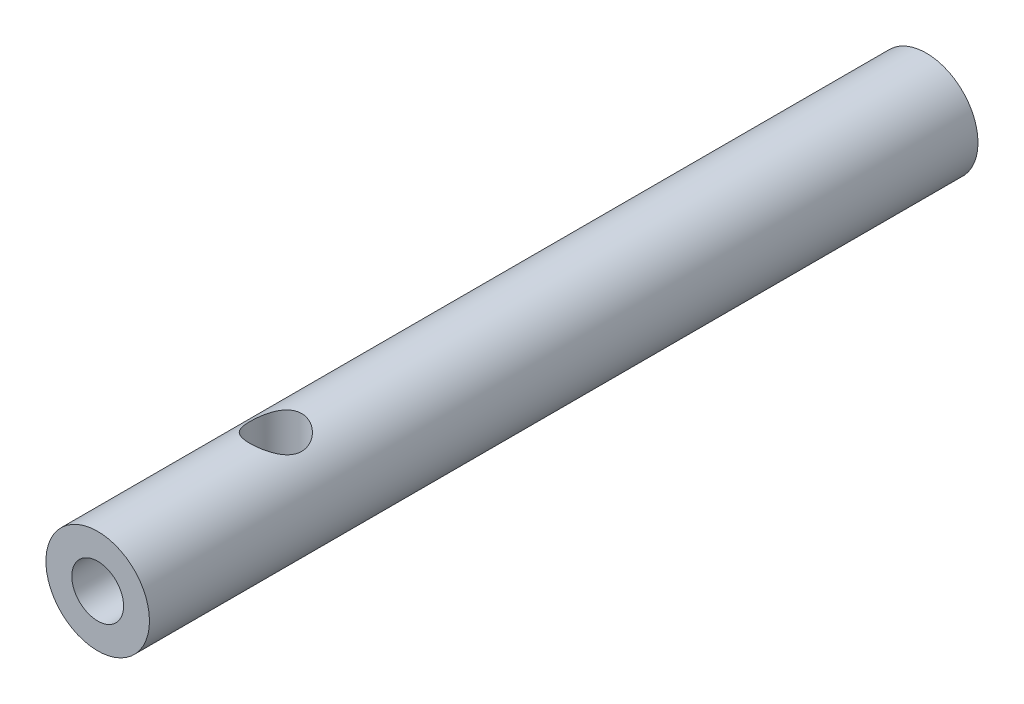
ISO-10303-21;
HEADER;
FILE_DESCRIPTION(('STEP AP214'),'2;1');
FILE_NAME('part.step','',(''),(''),'','','');
FILE_SCHEMA(('AUTOMOTIVE_DESIGN { 1 0 10303 214 1 1 1 1 }'));
ENDSEC;
DATA;
#1=APPLICATION_CONTEXT('core data for automotive mechanical design processes');
#2=APPLICATION_PROTOCOL_DEFINITION('international standard','automotive_design',2000,#1);
#3=PRODUCT_CONTEXT('',#1,'mechanical');
#4=PRODUCT('Part','Part','',(#3));
#5=PRODUCT_RELATED_PRODUCT_CATEGORY('part','',(#4));
#6=PRODUCT_DEFINITION_FORMATION('','',#4);
#7=PRODUCT_DEFINITION_CONTEXT('part definition',#1,'design');
#8=PRODUCT_DEFINITION('design','',#6,#7);
#9=PRODUCT_DEFINITION_SHAPE('','',#8);
#10=(LENGTH_UNIT() NAMED_UNIT(*) SI_UNIT(.MILLI.,.METRE.));
#11=(NAMED_UNIT(*) PLANE_ANGLE_UNIT() SI_UNIT($,.RADIAN.));
#12=(NAMED_UNIT(*) SI_UNIT($,.STERADIAN.) SOLID_ANGLE_UNIT());
#13=UNCERTAINTY_MEASURE_WITH_UNIT(LENGTH_MEASURE(1.E-05),#10,'distance_accuracy_value','');
#14=(GEOMETRIC_REPRESENTATION_CONTEXT(3) GLOBAL_UNCERTAINTY_ASSIGNED_CONTEXT((#13)) GLOBAL_UNIT_ASSIGNED_CONTEXT((#10,
#11,#12)) REPRESENTATION_CONTEXT('',''));
#15=CARTESIAN_POINT('',(0.,0.,0.));
#16=DIRECTION('',(0.,0.,1.));
#17=DIRECTION('',(1.,0.,0.));
#18=AXIS2_PLACEMENT_3D('',#15,#16,#17);
#19=CARTESIAN_POINT('',(0.,0.,-101.6));
#20=DIRECTION('',(0.,0.,1.));
#21=DIRECTION('',(1.,0.,0.));
#22=AXIS2_PLACEMENT_3D('',#19,#20,#21);
#23=CYLINDRICAL_SURFACE('',#22,6.35);
#24=CARTESIAN_POINT('',(0.,-6.35,-25.019));
#25=CARTESIAN_POINT('',(-0.0834969220594999,-6.34999931166444,-25.0189991122824));
#26=CARTESIAN_POINT('',(-0.167002655580042,-6.34834758911701,-25.015700125554));
#27=CARTESIAN_POINT('',(-0.333378330258781,-6.34179105821714,-25.0025541254501));
#28=CARTESIAN_POINT('',(-0.416247978955772,-6.33688483467113,-24.9927042634742));
#29=CARTESIAN_POINT('',(-0.66318203064701,-6.31742426748325,-24.953427934954));
#30=CARTESIAN_POINT('',(-0.825450146761554,-6.29812827299425,-24.9142749225986));
#31=CARTESIAN_POINT('',(-1.13965128900426,-6.2489182313574,-24.8120092887059));
#32=CARTESIAN_POINT('',(-1.29162180811868,-6.21904547786825,-24.7489897807566));
#33=CARTESIAN_POINT('',(-1.58264035037879,-6.15142812041637,-24.6012639263711));
#34=CARTESIAN_POINT('',(-1.72168939123018,-6.11368413715877,-24.516559289849));
#35=CARTESIAN_POINT('',(-1.99234108848171,-6.03111096182982,-24.3220303702658));
#36=CARTESIAN_POINT('',(-2.12298433900092,-5.98599127270818,-24.2109964222061));
#37=CARTESIAN_POINT('',(-2.36467069069853,-5.89470535591056,-23.9696033164272));
#38=CARTESIAN_POINT('',(-2.47569885601321,-5.84853836069043,-23.8392295702336));
#39=CARTESIAN_POINT('',(-2.68368848497886,-5.75623634934464,-23.5505790522467));
#40=CARTESIAN_POINT('',(-2.77889135161934,-5.71038146176788,-23.3909224686984));
#41=CARTESIAN_POINT('',(-2.90019349951534,-5.64919759286363,-23.1394520128256));
#42=CARTESIAN_POINT('',(-2.93705266116892,-5.63006420805933,-23.0535999381713));
#43=CARTESIAN_POINT('',(-3.00322508739606,-5.59504604853267,-22.8784143862936));
#44=CARTESIAN_POINT('',(-3.03254280972159,-5.57915935583429,-22.7890830018194));
#45=CARTESIAN_POINT('',(-3.08174263292982,-5.55212611635049,-22.6129894480353));
#46=CARTESIAN_POINT('',(-3.10208128111978,-5.54075429137746,-22.5263892059714));
#47=CARTESIAN_POINT('',(-3.13545600360765,-5.52193654886444,-22.3514127210056));
#48=CARTESIAN_POINT('',(-3.14849595237257,-5.51448854851135,-22.2630374462283));
#49=CARTESIAN_POINT('',(-3.1670771305344,-5.50383875782918,-22.0852932611514));
#50=CARTESIAN_POINT('',(-3.1726228759965,-5.50063441026522,-21.9959249820126));
#51=CARTESIAN_POINT('',(-3.17614778806993,-5.49859788398609,-21.8170192158219));
#52=CARTESIAN_POINT('',(-3.17412767659872,-5.49976528812799,-21.7274817457287));
#53=CARTESIAN_POINT('',(-3.1581193033026,-5.50899190362733,-21.4812521242756));
#54=CARTESIAN_POINT('',(-3.13621253452965,-5.52160857357707,-21.3251582701866));
#55=CARTESIAN_POINT('',(-3.07003746372168,-5.55866493052824,-21.0193533586935));
#56=CARTESIAN_POINT('',(-3.02576203854504,-5.58310838358077,-20.8696443509772));
#57=CARTESIAN_POINT('',(-2.91531509833647,-5.64157885407237,-20.5764557034359));
#58=CARTESIAN_POINT('',(-2.84865758129417,-5.67581583876129,-20.4332023900634));
#59=CARTESIAN_POINT('',(-2.69570761526054,-5.75003268807633,-20.159233913826));
#60=CARTESIAN_POINT('',(-2.60940634674629,-5.79001512927804,-20.0285244203915));
#61=CARTESIAN_POINT('',(-2.40685964249565,-5.87734289018611,-19.7658957257497));
#62=CARTESIAN_POINT('',(-2.28820488335253,-5.92497898403936,-19.6359246151435));
#63=CARTESIAN_POINT('',(-2.03058898448427,-6.01813700574905,-19.3969148571362));
#64=CARTESIAN_POINT('',(-1.89161819563546,-6.06365791538158,-19.2878862136413));
#65=CARTESIAN_POINT('',(-1.58913989972483,-6.1500381059768,-19.0890980802803));
#66=CARTESIAN_POINT('',(-1.42479265164788,-6.19058274974572,-19.0004685144201));
#67=CARTESIAN_POINT('',(-1.08098023585583,-6.25976272299952,-18.8528419183646));
#68=CARTESIAN_POINT('',(-0.901527205073896,-6.28840750578946,-18.7938213588683));
#69=CARTESIAN_POINT('',(-0.548533610626833,-6.32854759690358,-18.711940596601));
#70=CARTESIAN_POINT('',(-0.375734359385244,-6.34126679122995,-18.6864903274127));
#71=CARTESIAN_POINT('',(-0.0278752299448301,-6.35231817716325,-18.6643494777397));
#72=CARTESIAN_POINT('',(0.147183538060021,-6.35065718436129,-18.6676452728607));
#73=CARTESIAN_POINT('',(0.480164686080365,-6.33384535408399,-18.7014062359454));
#74=CARTESIAN_POINT('',(0.638363620564192,-6.31975005060431,-18.7297457914748));
#75=CARTESIAN_POINT('',(0.947441883053003,-6.28085393924121,-18.8094558782099));
#76=CARTESIAN_POINT('',(1.09832040207141,-6.25605195113515,-18.8608289484773));
#77=CARTESIAN_POINT('',(1.39347133182512,-6.19709998236334,-18.9864951309378));
#78=CARTESIAN_POINT('',(1.53743151047822,-6.16270299610717,-19.0614015841112));
#79=CARTESIAN_POINT('',(1.8112148234104,-6.08787118465664,-19.2313164256859));
#80=CARTESIAN_POINT('',(1.94103189959928,-6.0474337895468,-19.3263333773854));
#81=CARTESIAN_POINT('',(2.19636241342679,-5.95973602709938,-19.5445393503738));
#82=CARTESIAN_POINT('',(2.3202013468198,-5.91219559251098,-19.6695786071116));
#83=CARTESIAN_POINT('',(2.54589381918874,-5.81858093231368,-19.9387623551498));
#84=CARTESIAN_POINT('',(2.64773214935251,-5.77250773963547,-20.0829199523809));
#85=CARTESIAN_POINT('',(2.83117262876716,-5.68487535288742,-20.3950686019584));
#86=CARTESIAN_POINT('',(2.91155594998014,-5.64364281441821,-20.5638757695104));
#87=CARTESIAN_POINT('',(3.04191297152939,-5.5744767953732,-20.9153444648897));
#88=CARTESIAN_POINT('',(3.0919258549222,-5.54652618900868,-21.0979877978474));
#89=CARTESIAN_POINT('',(3.15551086037918,-5.51057765714603,-21.4531899564702));
#90=CARTESIAN_POINT('',(3.17212027309711,-5.50092192343245,-21.6250337504072));
#91=CARTESIAN_POINT('',(3.17718805563876,-5.49800001145358,-21.9692444424952));
#92=CARTESIAN_POINT('',(3.16565862768386,-5.50472672904441,-22.1416110815426));
#93=CARTESIAN_POINT('',(3.11761548073658,-5.53205211477784,-22.4646601030739));
#94=CARTESIAN_POINT('',(3.08358651207686,-5.55126823076269,-22.6158439417311));
#95=CARTESIAN_POINT('',(2.99458164828807,-5.59977978302582,-22.9101908301672));
#96=CARTESIAN_POINT('',(2.93959901505999,-5.62907846127335,-23.0533512828503));
#97=CARTESIAN_POINT('',(2.8061154442137,-5.69685576337174,-23.3382336994285));
#98=CARTESIAN_POINT('',(2.72628260503929,-5.73581889480533,-23.4792128093657));
#99=CARTESIAN_POINT('',(2.54682759156583,-5.81772207082382,-23.7466974317231));
#100=CARTESIAN_POINT('',(2.44719512169931,-5.8606641782013,-23.8731953599427));
#101=CARTESIAN_POINT('',(2.21680287661219,-5.95192753761203,-24.1240975241771));
#102=CARTESIAN_POINT('',(2.08373188558712,-6.00026839877346,-24.2463797564128));
#103=CARTESIAN_POINT('',(1.79751265125243,-6.0921234557675,-24.4673978732331));
#104=CARTESIAN_POINT('',(1.64435365457428,-6.13563504323043,-24.5661210659827));
#105=CARTESIAN_POINT('',(1.40178715704487,-6.19391073190243,-24.6942802661971));
#106=CARTESIAN_POINT('',(1.31842200030918,-6.21223173271383,-24.7338005836814));
#107=CARTESIAN_POINT('',(1.1480770102167,-6.24595363475604,-24.8055994748237));
#108=CARTESIAN_POINT('',(1.06109897786306,-6.26135597012704,-24.8378816065344));
#109=CARTESIAN_POINT('',(0.884361322813104,-6.28875097111981,-24.894759345915));
#110=CARTESIAN_POINT('',(0.794608244970568,-6.30075106809478,-24.9193717181381));
#111=CARTESIAN_POINT('',(0.612925661591578,-6.32100983571903,-24.9606673895299));
#112=CARTESIAN_POINT('',(0.520997521680286,-6.3292707916836,-24.9773555321935));
#113=CARTESIAN_POINT('',(0.357531347524371,-6.34032503263334,-24.9996162848624));
#114=CARTESIAN_POINT('',(0.286274046488593,-6.34394670812889,-25.0068788212496));
#115=CARTESIAN_POINT('',(0.143346668941345,-6.34878452045567,-25.0165711265376));
#116=CARTESIAN_POINT('',(0.0716765810914249,-6.35000059089052,-25.0190007620468));
#117=CARTESIAN_POINT('',(0.,-6.35,-25.019));
#118=B_SPLINE_CURVE_WITH_KNOTS('',3,(#24,#25,#26,#27,#28,#29,#30,#31,#32,#33,#34,#35,#36,#37,
#38,#39,#40,#41,#42,#43,#44,#45,#46,#47,#48,#49,#50,#51,#52,#53,#54,#55,#56,#57,#58,#59,#60,#61,
#62,#63,#64,#65,#66,#67,#68,#69,#70,#71,#72,#73,#74,#75,#76,#77,#78,#79,#80,#81,#82,#83,#84,#85,
#86,#87,#88,#89,#90,#91,#92,#93,#94,#95,#96,#97,#98,#99,#100,#101,#102,#103,#104,#105,#106,#107,
#108,#109,#110,#111,#112,#113,#114,#115,#116,#117),.UNSPECIFIED.,.T.,.F.,(4,2,2,2,2,2,2,2,2,2,2,
2,2,2,2,2,2,2,2,2,2,2,2,2,2,2,2,2,2,2,2,2,2,2,2,2,2,2,2,2,2,2,2,2,2,2,4),(0.,0.25041561210268,
0.500940186864014,1.00234854488129,1.50182051324263,2.00125310940106,2.53090025348452,
3.06094897410615,3.63210298373098,3.91787290005988,4.2034735073285,4.47213270490103,
4.74064915090149,5.00900371453887,5.27733267302577,5.74927594687739,6.22136960256846,
6.70445970327764,7.18776712794021,7.7323564652788,8.27720530143646,8.84735553323666,
9.41705196489304,9.93956405039339,10.4618285011675,10.9436138594975,11.4254523397102,
11.921067756814,12.4168946391879,12.9614122158799,13.5063050164601,14.077585736555,
14.6481278321882,15.1639000911419,15.6794487286237,16.1458838633213,16.6124691169503,
17.1104020806943,17.6085946442304,18.1673210354482,18.7263477502427,19.0082017078365,
19.2899168101042,19.5710117490933,19.8519346536844,20.0668939492148,20.2818591776892),.UNSPECIFIED.);
#119=CARTESIAN_POINT('',(0.,-6.35,-25.019));
#120=VERTEX_POINT('',#119);
#121=EDGE_CURVE('E52',#120,#120,#118,.T.);
#122=ORIENTED_EDGE('',*,*,#121,.T.);
#123=EDGE_LOOP('',(#122));
#124=FACE_BOUND('',#123,.T.);
#125=CARTESIAN_POINT('',(0.,0.,-101.6));
#126=DIRECTION('',(0.,0.,1.));
#127=DIRECTION('',(1.,0.,0.));
#128=AXIS2_PLACEMENT_3D('',#125,#126,#127);
#129=CIRCLE('',#128,6.35);
#130=CARTESIAN_POINT('',(6.35,0.,-101.6));
#131=VERTEX_POINT('',#130);
#132=EDGE_CURVE('E10',#131,#131,#129,.T.);
#133=ORIENTED_EDGE('',*,*,#132,.T.);
#134=EDGE_LOOP('',(#133));
#135=FACE_BOUND('',#134,.T.);
#136=CARTESIAN_POINT('',(0.,0.,0.));
#137=DIRECTION('',(0.,0.,1.));
#138=DIRECTION('',(1.,0.,0.));
#139=AXIS2_PLACEMENT_3D('',#136,#137,#138);
#140=CIRCLE('',#139,6.35);
#141=CARTESIAN_POINT('',(6.35,0.,0.));
#142=VERTEX_POINT('',#141);
#143=EDGE_CURVE('E42',#142,#142,#140,.T.);
#144=ORIENTED_EDGE('',*,*,#143,.F.);
#145=EDGE_LOOP('',(#144));
#146=FACE_BOUND('',#145,.T.);
#147=CARTESIAN_POINT('',(0.,6.35,-25.019));
#148=CARTESIAN_POINT('',(0.0834969220594999,6.34999931166444,-25.0189991122824));
#149=CARTESIAN_POINT('',(0.167002655580042,6.34834758911701,-25.015700125554));
#150=CARTESIAN_POINT('',(0.333378330258781,6.34179105821714,-25.0025541254501));
#151=CARTESIAN_POINT('',(0.416247978955772,6.33688483467113,-24.9927042634742));
#152=CARTESIAN_POINT('',(0.66318203064701,6.31742426748325,-24.953427934954));
#153=CARTESIAN_POINT('',(0.825450146761554,6.29812827299425,-24.9142749225986));
#154=CARTESIAN_POINT('',(1.13965128900426,6.2489182313574,-24.8120092887059));
#155=CARTESIAN_POINT('',(1.29162180811868,6.21904547786825,-24.7489897807566));
#156=CARTESIAN_POINT('',(1.58264035037879,6.15142812041637,-24.6012639263711));
#157=CARTESIAN_POINT('',(1.72168939123018,6.11368413715877,-24.516559289849));
#158=CARTESIAN_POINT('',(1.99234108848171,6.03111096182982,-24.3220303702658));
#159=CARTESIAN_POINT('',(2.12298433900092,5.98599127270818,-24.2109964222061));
#160=CARTESIAN_POINT('',(2.36467069069853,5.89470535591056,-23.9696033164272));
#161=CARTESIAN_POINT('',(2.47569885601321,5.84853836069043,-23.8392295702336));
#162=CARTESIAN_POINT('',(2.68368848497886,5.75623634934464,-23.5505790522467));
#163=CARTESIAN_POINT('',(2.77889135161934,5.71038146176788,-23.3909224686984));
#164=CARTESIAN_POINT('',(2.90019349951534,5.64919759286363,-23.1394520128256));
#165=CARTESIAN_POINT('',(2.93705266116892,5.63006420805933,-23.0535999381713));
#166=CARTESIAN_POINT('',(3.00322508739606,5.59504604853267,-22.8784143862936));
#167=CARTESIAN_POINT('',(3.03254280972159,5.57915935583429,-22.7890830018194));
#168=CARTESIAN_POINT('',(3.08174263292982,5.55212611635049,-22.6129894480353));
#169=CARTESIAN_POINT('',(3.10208128111978,5.54075429137746,-22.5263892059714));
#170=CARTESIAN_POINT('',(3.13545600360765,5.52193654886444,-22.3514127210056));
#171=CARTESIAN_POINT('',(3.14849595237257,5.51448854851135,-22.2630374462283));
#172=CARTESIAN_POINT('',(3.1670771305344,5.50383875782918,-22.0852932611514));
#173=CARTESIAN_POINT('',(3.1726228759965,5.50063441026522,-21.9959249820126));
#174=CARTESIAN_POINT('',(3.17614778806993,5.49859788398609,-21.8170192158219));
#175=CARTESIAN_POINT('',(3.17412767659872,5.49976528812799,-21.7274817457287));
#176=CARTESIAN_POINT('',(3.1581193033026,5.50899190362733,-21.4812521242756));
#177=CARTESIAN_POINT('',(3.13621253452965,5.52160857357707,-21.3251582701866));
#178=CARTESIAN_POINT('',(3.07003746372168,5.55866493052824,-21.0193533586935));
#179=CARTESIAN_POINT('',(3.02576203854504,5.58310838358077,-20.8696443509772));
#180=CARTESIAN_POINT('',(2.91531509833647,5.64157885407237,-20.5764557034359));
#181=CARTESIAN_POINT('',(2.84865758129417,5.67581583876129,-20.4332023900634));
#182=CARTESIAN_POINT('',(2.69570761526054,5.75003268807633,-20.159233913826));
#183=CARTESIAN_POINT('',(2.60940634674629,5.79001512927804,-20.0285244203915));
#184=CARTESIAN_POINT('',(2.40685964249565,5.87734289018611,-19.7658957257497));
#185=CARTESIAN_POINT('',(2.28820488335253,5.92497898403936,-19.6359246151435));
#186=CARTESIAN_POINT('',(2.03058898448427,6.01813700574905,-19.3969148571362));
#187=CARTESIAN_POINT('',(1.89161819563546,6.06365791538158,-19.2878862136413));
#188=CARTESIAN_POINT('',(1.58913989972483,6.1500381059768,-19.0890980802803));
#189=CARTESIAN_POINT('',(1.42479265164788,6.19058274974572,-19.0004685144201));
#190=CARTESIAN_POINT('',(1.08098023585583,6.25976272299952,-18.8528419183646));
#191=CARTESIAN_POINT('',(0.901527205073896,6.28840750578946,-18.7938213588683));
#192=CARTESIAN_POINT('',(0.548533610626833,6.32854759690358,-18.711940596601));
#193=CARTESIAN_POINT('',(0.375734359385244,6.34126679122995,-18.6864903274127));
#194=CARTESIAN_POINT('',(0.0278752299448301,6.35231817716325,-18.6643494777397));
#195=CARTESIAN_POINT('',(-0.147183538060021,6.35065718436129,-18.6676452728607));
#196=CARTESIAN_POINT('',(-0.480164686080365,6.33384535408399,-18.7014062359454));
#197=CARTESIAN_POINT('',(-0.638363620564192,6.31975005060431,-18.7297457914748));
#198=CARTESIAN_POINT('',(-0.947441883053003,6.28085393924121,-18.8094558782099));
#199=CARTESIAN_POINT('',(-1.09832040207141,6.25605195113515,-18.8608289484773));
#200=CARTESIAN_POINT('',(-1.39347133182512,6.19709998236334,-18.9864951309378));
#201=CARTESIAN_POINT('',(-1.53743151047822,6.16270299610717,-19.0614015841112));
#202=CARTESIAN_POINT('',(-1.8112148234104,6.08787118465664,-19.2313164256859));
#203=CARTESIAN_POINT('',(-1.94103189959928,6.0474337895468,-19.3263333773854));
#204=CARTESIAN_POINT('',(-2.19636241342679,5.95973602709938,-19.5445393503738));
#205=CARTESIAN_POINT('',(-2.3202013468198,5.91219559251098,-19.6695786071116));
#206=CARTESIAN_POINT('',(-2.54589381918874,5.81858093231368,-19.9387623551498));
#207=CARTESIAN_POINT('',(-2.64773214935251,5.77250773963547,-20.0829199523809));
#208=CARTESIAN_POINT('',(-2.83117262876716,5.68487535288742,-20.3950686019584));
#209=CARTESIAN_POINT('',(-2.91155594998014,5.64364281441821,-20.5638757695104));
#210=CARTESIAN_POINT('',(-3.04191297152939,5.5744767953732,-20.9153444648897));
#211=CARTESIAN_POINT('',(-3.0919258549222,5.54652618900868,-21.0979877978474));
#212=CARTESIAN_POINT('',(-3.15551086037918,5.51057765714603,-21.4531899564702));
#213=CARTESIAN_POINT('',(-3.17212027309711,5.50092192343245,-21.6250337504072));
#214=CARTESIAN_POINT('',(-3.17718805563876,5.49800001145358,-21.9692444424952));
#215=CARTESIAN_POINT('',(-3.16565862768386,5.50472672904441,-22.1416110815426));
#216=CARTESIAN_POINT('',(-3.11761548073658,5.53205211477784,-22.4646601030739));
#217=CARTESIAN_POINT('',(-3.08358651207686,5.55126823076269,-22.6158439417311));
#218=CARTESIAN_POINT('',(-2.99458164828807,5.59977978302582,-22.9101908301672));
#219=CARTESIAN_POINT('',(-2.93959901505999,5.62907846127335,-23.0533512828503));
#220=CARTESIAN_POINT('',(-2.8061154442137,5.69685576337174,-23.3382336994285));
#221=CARTESIAN_POINT('',(-2.72628260503929,5.73581889480533,-23.4792128093657));
#222=CARTESIAN_POINT('',(-2.54682759156583,5.81772207082382,-23.7466974317231));
#223=CARTESIAN_POINT('',(-2.44719512169931,5.8606641782013,-23.8731953599427));
#224=CARTESIAN_POINT('',(-2.21680287661219,5.95192753761203,-24.1240975241771));
#225=CARTESIAN_POINT('',(-2.08373188558712,6.00026839877346,-24.2463797564128));
#226=CARTESIAN_POINT('',(-1.79751265125243,6.0921234557675,-24.4673978732331));
#227=CARTESIAN_POINT('',(-1.64435365457428,6.13563504323043,-24.5661210659827));
#228=CARTESIAN_POINT('',(-1.40178715704487,6.19391073190243,-24.6942802661971));
#229=CARTESIAN_POINT('',(-1.31842200030918,6.21223173271383,-24.7338005836814));
#230=CARTESIAN_POINT('',(-1.1480770102167,6.24595363475604,-24.8055994748237));
#231=CARTESIAN_POINT('',(-1.06109897786306,6.26135597012704,-24.8378816065344));
#232=CARTESIAN_POINT('',(-0.884361322813104,6.28875097111981,-24.894759345915));
#233=CARTESIAN_POINT('',(-0.794608244970568,6.30075106809478,-24.9193717181381));
#234=CARTESIAN_POINT('',(-0.612925661591578,6.32100983571903,-24.9606673895299));
#235=CARTESIAN_POINT('',(-0.520997521680286,6.3292707916836,-24.9773555321935));
#236=CARTESIAN_POINT('',(-0.357531347524371,6.34032503263334,-24.9996162848624));
#237=CARTESIAN_POINT('',(-0.286274046488593,6.34394670812889,-25.0068788212496));
#238=CARTESIAN_POINT('',(-0.143346668941345,6.34878452045567,-25.0165711265376));
#239=CARTESIAN_POINT('',(-0.0716765810914249,6.35000059089052,-25.0190007620468));
#240=CARTESIAN_POINT('',(0.,6.35,-25.019));
#241=B_SPLINE_CURVE_WITH_KNOTS('',3,(#147,#148,#149,#150,#151,#152,#153,#154,#155,#156,#157,
#158,#159,#160,#161,#162,#163,#164,#165,#166,#167,#168,#169,#170,#171,#172,#173,#174,#175,#176,
#177,#178,#179,#180,#181,#182,#183,#184,#185,#186,#187,#188,#189,#190,#191,#192,#193,#194,#195,
#196,#197,#198,#199,#200,#201,#202,#203,#204,#205,#206,#207,#208,#209,#210,#211,#212,#213,#214,
#215,#216,#217,#218,#219,#220,#221,#222,#223,#224,#225,#226,#227,#228,#229,#230,#231,#232,#233,
#234,#235,#236,#237,#238,#239,#240),.UNSPECIFIED.,.T.,.F.,(4,2,2,2,2,2,2,2,2,2,2,2,2,2,2,2,2,2,
2,2,2,2,2,2,2,2,2,2,2,2,2,2,2,2,2,2,2,2,2,2,2,2,2,2,2,2,4),(0.,0.25041561210268,
0.500940186864014,1.00234854488129,1.50182051324263,2.00125310940106,2.53090025348452,
3.06094897410615,3.63210298373098,3.91787290005988,4.2034735073285,4.47213270490103,
4.74064915090149,5.00900371453887,5.27733267302577,5.74927594687739,6.22136960256846,
6.70445970327764,7.18776712794021,7.7323564652788,8.27720530143646,8.84735553323666,
9.41705196489304,9.93956405039339,10.4618285011675,10.9436138594975,11.4254523397102,
11.921067756814,12.4168946391879,12.9614122158799,13.5063050164601,14.077585736555,
14.6481278321882,15.1639000911419,15.6794487286237,16.1458838633213,16.6124691169503,
17.1104020806943,17.6085946442304,18.1673210354482,18.7263477502427,19.0082017078365,
19.2899168101042,19.5710117490933,19.8519346536844,20.0668939492148,20.2818591776892),.UNSPECIFIED.);
#242=CARTESIAN_POINT('',(0.,6.35,-25.019));
#243=VERTEX_POINT('',#242);
#244=EDGE_CURVE('E35',#243,#243,#241,.T.);
#245=ORIENTED_EDGE('',*,*,#244,.T.);
#246=EDGE_LOOP('',(#245));
#247=FACE_BOUND('',#246,.T.);
#248=ADVANCED_FACE('F31',(#124,#135,#146,#247),#23,.T.);
#249=CARTESIAN_POINT('',(0.,0.,-101.6));
#250=DIRECTION('',(0.,0.,1.));
#251=DIRECTION('',(1.,0.,0.));
#252=AXIS2_PLACEMENT_3D('',#249,#250,#251);
#253=PLANE('',#252);
#254=CARTESIAN_POINT('',(0.,0.,-101.6));
#255=DIRECTION('',(0.,0.,-1.));
#256=DIRECTION('',(-1.,0.,0.));
#257=AXIS2_PLACEMENT_3D('',#254,#255,#256);
#258=CIRCLE('',#257,3.175);
#259=CARTESIAN_POINT('',(-3.175,0.,-101.6));
#260=VERTEX_POINT('',#259);
#261=EDGE_CURVE('E50',#260,#260,#258,.T.);
#262=ORIENTED_EDGE('',*,*,#261,.F.);
#263=EDGE_LOOP('',(#262));
#264=FACE_BOUND('',#263,.T.);
#265=ORIENTED_EDGE('',*,*,#132,.F.);
#266=EDGE_LOOP('',(#265));
#267=FACE_BOUND('',#266,.T.);
#268=ADVANCED_FACE('F75',(#264,#267),#253,.F.);
#269=CARTESIAN_POINT('',(0.,0.,0.));
#270=DIRECTION('',(0.,0.,1.));
#271=DIRECTION('',(1.,0.,0.));
#272=AXIS2_PLACEMENT_3D('',#269,#270,#271);
#273=PLANE('',#272);
#274=CARTESIAN_POINT('',(0.,0.,0.));
#275=DIRECTION('',(0.,0.,1.));
#276=DIRECTION('',(1.,0.,0.));
#277=AXIS2_PLACEMENT_3D('',#274,#275,#276);
#278=CIRCLE('',#277,3.175);
#279=CARTESIAN_POINT('',(3.175,0.,0.));
#280=VERTEX_POINT('',#279);
#281=EDGE_CURVE('E100',#280,#280,#278,.T.);
#282=ORIENTED_EDGE('',*,*,#281,.F.);
#283=EDGE_LOOP('',(#282));
#284=FACE_BOUND('',#283,.T.);
#285=ORIENTED_EDGE('',*,*,#143,.T.);
#286=EDGE_LOOP('',(#285));
#287=FACE_BOUND('',#286,.T.);
#288=ADVANCED_FACE('F73',(#284,#287),#273,.T.);
#289=CARTESIAN_POINT('',(0.,0.,-88.9));
#290=DIRECTION('',(0.,0.,-1.));
#291=DIRECTION('',(-1.,0.,0.));
#292=AXIS2_PLACEMENT_3D('',#289,#290,#291);
#293=CYLINDRICAL_SURFACE('',#292,3.175);
#294=CARTESIAN_POINT('',(0.,0.,-88.9));
#295=DIRECTION('',(0.,0.,-1.));
#296=DIRECTION('',(-1.,0.,0.));
#297=AXIS2_PLACEMENT_3D('',#294,#295,#296);
#298=CIRCLE('',#297,3.175);
#299=CARTESIAN_POINT('',(-3.175,0.,-88.9));
#300=VERTEX_POINT('',#299);
#301=EDGE_CURVE('E47',#300,#300,#298,.T.);
#302=ORIENTED_EDGE('',*,*,#301,.F.);
#303=EDGE_LOOP('',(#302));
#304=FACE_BOUND('',#303,.T.);
#305=ORIENTED_EDGE('',*,*,#261,.T.);
#306=EDGE_LOOP('',(#305));
#307=FACE_BOUND('',#306,.T.);
#308=ADVANCED_FACE('F69',(#304,#307),#293,.F.);
#309=CARTESIAN_POINT('',(0.,0.,-88.9));
#310=DIRECTION('',(0.,0.,-1.));
#311=DIRECTION('',(-1.,0.,0.));
#312=AXIS2_PLACEMENT_3D('',#309,#310,#311);
#313=PLANE('',#312);
#314=ORIENTED_EDGE('',*,*,#301,.T.);
#315=EDGE_LOOP('',(#314));
#316=FACE_BOUND('',#315,.T.);
#317=ADVANCED_FACE('F63',(#316),#313,.T.);
#318=CARTESIAN_POINT('',(0.,7.62,-21.844));
#319=DIRECTION('',(0.,-1.,0.));
#320=DIRECTION('',(0.,0.,-1.));
#321=AXIS2_PLACEMENT_3D('',#318,#319,#320);
#322=CYLINDRICAL_SURFACE('',#321,3.175);
#323=ORIENTED_EDGE('',*,*,#244,.F.);
#324=EDGE_LOOP('',(#323));
#325=FACE_BOUND('',#324,.T.);
#326=ORIENTED_EDGE('',*,*,#121,.F.);
#327=EDGE_LOOP('',(#326));
#328=FACE_BOUND('',#327,.T.);
#329=ADVANCED_FACE('F57',(#325,#328),#322,.F.);
#330=CARTESIAN_POINT('',(0.,0.,-12.7));
#331=DIRECTION('',(0.,0.,1.));
#332=DIRECTION('',(1.,0.,0.));
#333=AXIS2_PLACEMENT_3D('',#330,#331,#332);
#334=CYLINDRICAL_SURFACE('',#333,3.175);
#335=CARTESIAN_POINT('',(0.,0.,-12.7));
#336=DIRECTION('',(0.,0.,1.));
#337=DIRECTION('',(1.,0.,0.));
#338=AXIS2_PLACEMENT_3D('',#335,#336,#337);
#339=CIRCLE('',#338,3.175);
#340=CARTESIAN_POINT('',(3.175,0.,-12.7));
#341=VERTEX_POINT('',#340);
#342=EDGE_CURVE('E56',#341,#341,#339,.T.);
#343=ORIENTED_EDGE('',*,*,#342,.F.);
#344=EDGE_LOOP('',(#343));
#345=FACE_BOUND('',#344,.T.);
#346=ORIENTED_EDGE('',*,*,#281,.T.);
#347=EDGE_LOOP('',(#346));
#348=FACE_BOUND('',#347,.T.);
#349=ADVANCED_FACE('F62',(#345,#348),#334,.F.);
#350=CARTESIAN_POINT('',(0.,0.,-12.7));
#351=DIRECTION('',(0.,0.,1.));
#352=DIRECTION('',(1.,0.,0.));
#353=AXIS2_PLACEMENT_3D('',#350,#351,#352);
#354=PLANE('',#353);
#355=ORIENTED_EDGE('',*,*,#342,.T.);
#356=EDGE_LOOP('',(#355));
#357=FACE_BOUND('',#356,.T.);
#358=ADVANCED_FACE('F106',(#357),#354,.T.);
#359=CLOSED_SHELL('',(#248,#268,#288,#308,#317,#329,#349,#358));
#360=MANIFOLD_SOLID_BREP('B2',#359);
#361=ADVANCED_BREP_SHAPE_REPRESENTATION('',(#18,#360),#14);
#362=SHAPE_DEFINITION_REPRESENTATION(#9,#361);
ENDSEC;
END-ISO-10303-21;
